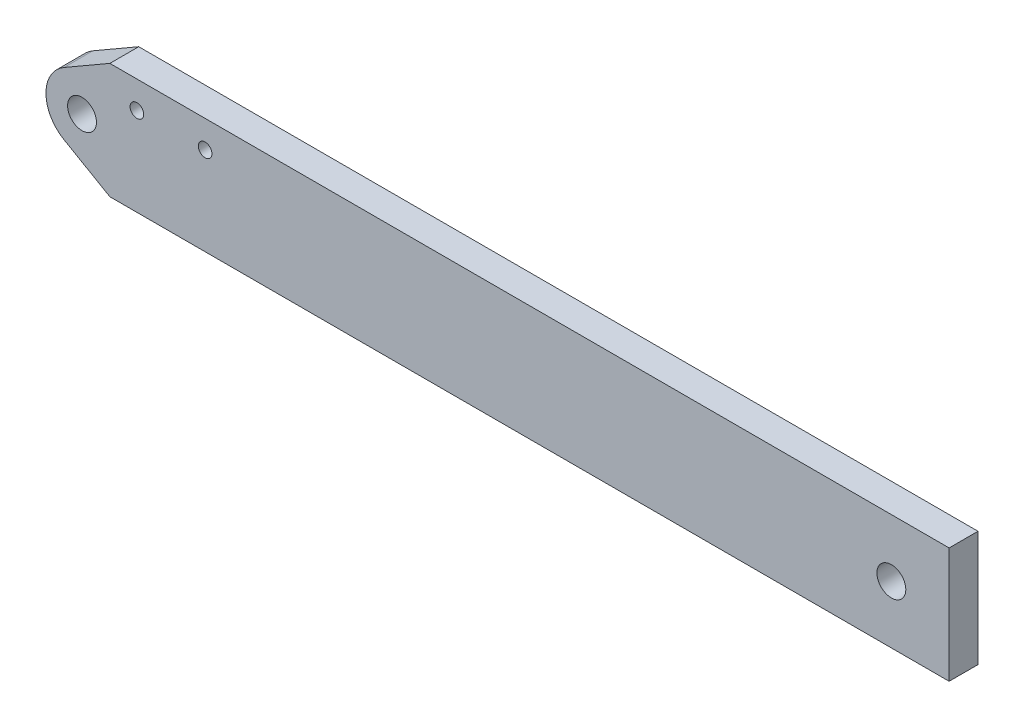
ISO-10303-21;
HEADER;
FILE_DESCRIPTION(('STEP AP214'),'2;1');
FILE_NAME('part.step','',(''),(''),'','','');
FILE_SCHEMA(('AUTOMOTIVE_DESIGN { 1 0 10303 214 1 1 1 1 }'));
ENDSEC;
DATA;
#1=APPLICATION_CONTEXT('core data for automotive mechanical design processes');
#2=APPLICATION_PROTOCOL_DEFINITION('international standard','automotive_design',2000,#1);
#3=PRODUCT_CONTEXT('',#1,'mechanical');
#4=PRODUCT('Part','Part','',(#3));
#5=PRODUCT_RELATED_PRODUCT_CATEGORY('part','',(#4));
#6=PRODUCT_DEFINITION_FORMATION('','',#4);
#7=PRODUCT_DEFINITION_CONTEXT('part definition',#1,'design');
#8=PRODUCT_DEFINITION('design','',#6,#7);
#9=PRODUCT_DEFINITION_SHAPE('','',#8);
#10=(LENGTH_UNIT() NAMED_UNIT(*) SI_UNIT(.MILLI.,.METRE.));
#11=(NAMED_UNIT(*) PLANE_ANGLE_UNIT() SI_UNIT($,.RADIAN.));
#12=(NAMED_UNIT(*) SI_UNIT($,.STERADIAN.) SOLID_ANGLE_UNIT());
#13=UNCERTAINTY_MEASURE_WITH_UNIT(LENGTH_MEASURE(1.E-05),#10,'distance_accuracy_value','');
#14=(GEOMETRIC_REPRESENTATION_CONTEXT(3) GLOBAL_UNCERTAINTY_ASSIGNED_CONTEXT((#13)) GLOBAL_UNIT_ASSIGNED_CONTEXT((#10,
#11,#12)) REPRESENTATION_CONTEXT('',''));
#15=CARTESIAN_POINT('',(0.,0.,0.));
#16=DIRECTION('',(0.,0.,1.));
#17=DIRECTION('',(1.,0.,0.));
#18=AXIS2_PLACEMENT_3D('',#15,#16,#17);
#19=CARTESIAN_POINT('',(200.,0.,0.));
#20=DIRECTION('',(0.,0.,-1.));
#21=DIRECTION('',(-1.,0.,0.));
#22=AXIS2_PLACEMENT_3D('',#19,#20,#21);
#23=PLANE('',#22);
#24=CARTESIAN_POINT('',(36.385,19.4,0.));
#25=DIRECTION('',(0.,0.,1.));
#26=DIRECTION('',(1.,0.,0.));
#27=AXIS2_PLACEMENT_3D('',#24,#25,#26);
#28=CIRCLE('',#27,1.5);
#29=CARTESIAN_POINT('',(37.885,19.4,0.));
#30=VERTEX_POINT('',#29);
#31=EDGE_CURVE('E149',#30,#30,#28,.T.);
#32=ORIENTED_EDGE('',*,*,#31,.F.);
#33=EDGE_LOOP('',(#32));
#34=FACE_BOUND('',#33,.T.);
#35=CARTESIAN_POINT('',(21.385,19.4,0.));
#36=DIRECTION('',(0.,0.,1.));
#37=DIRECTION('',(1.,0.,0.));
#38=AXIS2_PLACEMENT_3D('',#35,#36,#37);
#39=CIRCLE('',#38,1.5);
#40=CARTESIAN_POINT('',(22.885,19.4,0.));
#41=VERTEX_POINT('',#40);
#42=EDGE_CURVE('E143',#41,#41,#39,.T.);
#43=ORIENTED_EDGE('',*,*,#42,.F.);
#44=EDGE_LOOP('',(#43));
#45=FACE_BOUND('',#44,.T.);
#46=CARTESIAN_POINT('',(9.325,12.7,0.));
#47=DIRECTION('',(0.,0.,1.));
#48=DIRECTION('',(1.,0.,0.));
#49=AXIS2_PLACEMENT_3D('',#46,#47,#48);
#50=CIRCLE('',#49,3.175);
#51=CARTESIAN_POINT('',(12.5,12.7,0.));
#52=VERTEX_POINT('',#51);
#53=EDGE_CURVE('E124',#52,#52,#50,.T.);
#54=ORIENTED_EDGE('',*,*,#53,.F.);
#55=EDGE_LOOP('',(#54));
#56=FACE_BOUND('',#55,.T.);
#57=CARTESIAN_POINT('',(187.3,12.7,0.));
#58=DIRECTION('',(0.,0.,1.));
#59=DIRECTION('',(1.,0.,0.));
#60=AXIS2_PLACEMENT_3D('',#57,#58,#59);
#61=CIRCLE('',#60,3.175);
#62=CARTESIAN_POINT('',(190.475,12.7,0.));
#63=VERTEX_POINT('',#62);
#64=EDGE_CURVE('E118',#63,#63,#61,.T.);
#65=ORIENTED_EDGE('',*,*,#64,.F.);
#66=EDGE_LOOP('',(#65));
#67=FACE_BOUND('',#66,.T.);
#68=DIRECTION('',(-1.,0.,0.));
#69=VECTOR('',#68,1.);
#70=CARTESIAN_POINT('',(200.,25.4,0.));
#71=LINE('',#70,#69);
#72=CARTESIAN_POINT('',(200.,25.4,0.));
#73=VERTEX_POINT('',#72);
#74=CARTESIAN_POINT('',(15.4420452561249,25.4,0.));
#75=VERTEX_POINT('',#74);
#76=EDGE_CURVE('E105',#73,#75,#71,.T.);
#77=ORIENTED_EDGE('',*,*,#76,.T.);
#78=DIRECTION('',(0.866025403784442,0.499999999999994,0.));
#79=VECTOR('',#78,1.);
#80=CARTESIAN_POINT('',(5.35499967472869,19.576241518253,0.));
#81=LINE('',#80,#79);
#82=CARTESIAN_POINT('',(5.35499967472869,19.576241518253,0.));
#83=VERTEX_POINT('',#82);
#84=EDGE_CURVE('E46',#83,#75,#81,.T.);
#85=ORIENTED_EDGE('',*,*,#84,.F.);
#86=CARTESIAN_POINT('',(9.325,12.7,0.));
#87=DIRECTION('',(0.,0.,-1.));
#88=DIRECTION('',(1.,0.,0.));
#89=AXIS2_PLACEMENT_3D('',#86,#87,#88);
#90=CIRCLE('',#89,7.94000000000001);
#91=CARTESIAN_POINT('',(5.35499967472869,5.82375848174704,0.));
#92=VERTEX_POINT('',#91);
#93=EDGE_CURVE('E102',#92,#83,#90,.T.);
#94=ORIENTED_EDGE('',*,*,#93,.F.);
#95=DIRECTION('',(-0.866025403784442,0.499999999999994,0.));
#96=VECTOR('',#95,1.);
#97=CARTESIAN_POINT('',(15.4420452561249,0.,0.));
#98=LINE('',#97,#96);
#99=CARTESIAN_POINT('',(15.4420452561249,0.,0.));
#100=VERTEX_POINT('',#99);
#101=EDGE_CURVE('E136',#100,#92,#98,.T.);
#102=ORIENTED_EDGE('',*,*,#101,.F.);
#103=DIRECTION('',(-1.,0.,0.));
#104=VECTOR('',#103,1.);
#105=CARTESIAN_POINT('',(200.,0.,0.));
#106=LINE('',#105,#104);
#107=CARTESIAN_POINT('',(200.,0.,0.));
#108=VERTEX_POINT('',#107);
#109=EDGE_CURVE('E11',#108,#100,#106,.T.);
#110=ORIENTED_EDGE('',*,*,#109,.F.);
#111=DIRECTION('',(0.,-1.,0.));
#112=VECTOR('',#111,1.);
#113=CARTESIAN_POINT('',(200.,0.,0.));
#114=LINE('',#113,#112);
#115=EDGE_CURVE('E115',#73,#108,#114,.T.);
#116=ORIENTED_EDGE('',*,*,#115,.F.);
#117=EDGE_LOOP('',(#77,#85,#94,#102,#110,#116));
#118=FACE_BOUND('',#117,.T.);
#119=ADVANCED_FACE('F32',(#34,#45,#56,#67,#118),#23,.F.);
#120=CARTESIAN_POINT('',(200.,0.,0.));
#121=DIRECTION('',(0.,1.,0.));
#122=DIRECTION('',(0.,0.,1.));
#123=AXIS2_PLACEMENT_3D('',#120,#121,#122);
#124=PLANE('',#123);
#125=ORIENTED_EDGE('',*,*,#109,.T.);
#126=DIRECTION('',(0.,0.,1.));
#127=VECTOR('',#126,1.);
#128=CARTESIAN_POINT('',(15.4420452561249,0.,-6.35));
#129=LINE('',#128,#127);
#130=CARTESIAN_POINT('',(15.4420452561249,0.,-6.35));
#131=VERTEX_POINT('',#130);
#132=EDGE_CURVE('E91',#131,#100,#129,.T.);
#133=ORIENTED_EDGE('',*,*,#132,.F.);
#134=DIRECTION('',(-1.,0.,0.));
#135=VECTOR('',#134,1.);
#136=CARTESIAN_POINT('',(200.,0.,-6.35));
#137=LINE('',#136,#135);
#138=CARTESIAN_POINT('',(200.,0.,-6.35));
#139=VERTEX_POINT('',#138);
#140=EDGE_CURVE('E39',#139,#131,#137,.T.);
#141=ORIENTED_EDGE('',*,*,#140,.F.);
#142=DIRECTION('',(0.,0.,-1.));
#143=VECTOR('',#142,1.);
#144=CARTESIAN_POINT('',(200.,0.,0.));
#145=LINE('',#144,#143);
#146=EDGE_CURVE('E113',#108,#139,#145,.T.);
#147=ORIENTED_EDGE('',*,*,#146,.F.);
#148=EDGE_LOOP('',(#125,#133,#141,#147));
#149=FACE_BOUND('',#148,.T.);
#150=ADVANCED_FACE('F166',(#149),#124,.F.);
#151=CARTESIAN_POINT('',(200.,0.,-6.35));
#152=DIRECTION('',(0.,0.,1.));
#153=DIRECTION('',(0.,-1.,0.));
#154=AXIS2_PLACEMENT_3D('',#151,#152,#153);
#155=PLANE('',#154);
#156=CARTESIAN_POINT('',(36.385,19.4,-6.35));
#157=DIRECTION('',(0.,0.,1.));
#158=DIRECTION('',(1.,0.,0.));
#159=AXIS2_PLACEMENT_3D('',#156,#157,#158);
#160=CIRCLE('',#159,1.5);
#161=CARTESIAN_POINT('',(37.885,19.4,-6.35));
#162=VERTEX_POINT('',#161);
#163=EDGE_CURVE('E146',#162,#162,#160,.T.);
#164=ORIENTED_EDGE('',*,*,#163,.T.);
#165=EDGE_LOOP('',(#164));
#166=FACE_BOUND('',#165,.T.);
#167=CARTESIAN_POINT('',(21.385,19.4,-6.35));
#168=DIRECTION('',(0.,0.,1.));
#169=DIRECTION('',(1.,0.,0.));
#170=AXIS2_PLACEMENT_3D('',#167,#168,#169);
#171=CIRCLE('',#170,1.5);
#172=CARTESIAN_POINT('',(22.885,19.4,-6.35));
#173=VERTEX_POINT('',#172);
#174=EDGE_CURVE('E140',#173,#173,#171,.T.);
#175=ORIENTED_EDGE('',*,*,#174,.T.);
#176=EDGE_LOOP('',(#175));
#177=FACE_BOUND('',#176,.T.);
#178=CARTESIAN_POINT('',(9.325,12.7,-6.35));
#179=DIRECTION('',(0.,0.,1.));
#180=DIRECTION('',(1.,0.,0.));
#181=AXIS2_PLACEMENT_3D('',#178,#179,#180);
#182=CIRCLE('',#181,3.175);
#183=CARTESIAN_POINT('',(12.5,12.7,-6.35));
#184=VERTEX_POINT('',#183);
#185=EDGE_CURVE('E121',#184,#184,#182,.T.);
#186=ORIENTED_EDGE('',*,*,#185,.T.);
#187=EDGE_LOOP('',(#186));
#188=FACE_BOUND('',#187,.T.);
#189=CARTESIAN_POINT('',(187.3,12.7,-6.35));
#190=DIRECTION('',(0.,0.,1.));
#191=DIRECTION('',(1.,0.,0.));
#192=AXIS2_PLACEMENT_3D('',#189,#190,#191);
#193=CIRCLE('',#192,3.175);
#194=CARTESIAN_POINT('',(190.475,12.7,-6.35));
#195=VERTEX_POINT('',#194);
#196=EDGE_CURVE('E117',#195,#195,#193,.T.);
#197=ORIENTED_EDGE('',*,*,#196,.T.);
#198=EDGE_LOOP('',(#197));
#199=FACE_BOUND('',#198,.T.);
#200=CARTESIAN_POINT('',(9.325,12.7,-6.35));
#201=DIRECTION('',(0.,0.,-1.));
#202=DIRECTION('',(1.,0.,0.));
#203=AXIS2_PLACEMENT_3D('',#200,#201,#202);
#204=CIRCLE('',#203,7.94000000000001);
#205=CARTESIAN_POINT('',(5.35499967472869,5.82375848174704,-6.35));
#206=VERTEX_POINT('',#205);
#207=CARTESIAN_POINT('',(5.35499967472869,19.576241518253,-6.35));
#208=VERTEX_POINT('',#207);
#209=EDGE_CURVE('E92',#206,#208,#204,.T.);
#210=ORIENTED_EDGE('',*,*,#209,.T.);
#211=DIRECTION('',(0.866025403784442,0.499999999999994,0.));
#212=VECTOR('',#211,1.);
#213=CARTESIAN_POINT('',(5.35499967472869,19.576241518253,-6.35));
#214=LINE('',#213,#212);
#215=CARTESIAN_POINT('',(15.4420452561249,25.4,-6.35));
#216=VERTEX_POINT('',#215);
#217=EDGE_CURVE('E86',#208,#216,#214,.T.);
#218=ORIENTED_EDGE('',*,*,#217,.T.);
#219=DIRECTION('',(-1.,0.,0.));
#220=VECTOR('',#219,1.);
#221=CARTESIAN_POINT('',(200.,25.4,-6.35));
#222=LINE('',#221,#220);
#223=CARTESIAN_POINT('',(200.,25.4,-6.35));
#224=VERTEX_POINT('',#223);
#225=EDGE_CURVE('E98',#224,#216,#222,.T.);
#226=ORIENTED_EDGE('',*,*,#225,.F.);
#227=DIRECTION('',(0.,1.,0.));
#228=VECTOR('',#227,1.);
#229=CARTESIAN_POINT('',(200.,0.,-6.35));
#230=LINE('',#229,#228);
#231=EDGE_CURVE('E111',#139,#224,#230,.T.);
#232=ORIENTED_EDGE('',*,*,#231,.F.);
#233=ORIENTED_EDGE('',*,*,#140,.T.);
#234=DIRECTION('',(-0.866025403784442,0.499999999999994,0.));
#235=VECTOR('',#234,1.);
#236=CARTESIAN_POINT('',(15.4420452561249,0.,-6.35));
#237=LINE('',#236,#235);
#238=EDGE_CURVE('E101',#131,#206,#237,.T.);
#239=ORIENTED_EDGE('',*,*,#238,.T.);
#240=EDGE_LOOP('',(#210,#218,#226,#232,#233,#239));
#241=FACE_BOUND('',#240,.T.);
#242=ADVANCED_FACE('F96',(#166,#177,#188,#199,#241),#155,.F.);
#243=CARTESIAN_POINT('',(200.,25.4,0.));
#244=DIRECTION('',(0.,-1.,0.));
#245=DIRECTION('',(0.,0.,-1.));
#246=AXIS2_PLACEMENT_3D('',#243,#244,#245);
#247=PLANE('',#246);
#248=ORIENTED_EDGE('',*,*,#225,.T.);
#249=DIRECTION('',(0.,0.,1.));
#250=VECTOR('',#249,1.);
#251=CARTESIAN_POINT('',(15.4420452561249,25.4,-6.35));
#252=LINE('',#251,#250);
#253=EDGE_CURVE('E83',#216,#75,#252,.T.);
#254=ORIENTED_EDGE('',*,*,#253,.T.);
#255=ORIENTED_EDGE('',*,*,#76,.F.);
#256=DIRECTION('',(0.,0.,1.));
#257=VECTOR('',#256,1.);
#258=CARTESIAN_POINT('',(200.,25.4,0.));
#259=LINE('',#258,#257);
#260=EDGE_CURVE('E54',#224,#73,#259,.T.);
#261=ORIENTED_EDGE('',*,*,#260,.F.);
#262=EDGE_LOOP('',(#248,#254,#255,#261));
#263=FACE_BOUND('',#262,.T.);
#264=ADVANCED_FACE('F104',(#263),#247,.F.);
#265=CARTESIAN_POINT('',(200.,0.,0.));
#266=DIRECTION('',(-1.,0.,0.));
#267=DIRECTION('',(0.,0.,1.));
#268=AXIS2_PLACEMENT_3D('',#265,#266,#267);
#269=PLANE('',#268);
#270=ORIENTED_EDGE('',*,*,#115,.T.);
#271=ORIENTED_EDGE('',*,*,#146,.T.);
#272=ORIENTED_EDGE('',*,*,#231,.T.);
#273=ORIENTED_EDGE('',*,*,#260,.T.);
#274=EDGE_LOOP('',(#270,#271,#272,#273));
#275=FACE_BOUND('',#274,.T.);
#276=ADVANCED_FACE('F177',(#275),#269,.F.);
#277=CARTESIAN_POINT('',(187.3,12.7,-6.35));
#278=DIRECTION('',(0.,0.,1.));
#279=DIRECTION('',(1.,0.,0.));
#280=AXIS2_PLACEMENT_3D('',#277,#278,#279);
#281=CYLINDRICAL_SURFACE('',#280,3.175);
#282=ORIENTED_EDGE('',*,*,#196,.F.);
#283=EDGE_LOOP('',(#282));
#284=FACE_BOUND('',#283,.T.);
#285=ORIENTED_EDGE('',*,*,#64,.T.);
#286=EDGE_LOOP('',(#285));
#287=FACE_BOUND('',#286,.T.);
#288=ADVANCED_FACE('F198',(#284,#287),#281,.F.);
#289=CARTESIAN_POINT('',(9.325,12.7,-6.35));
#290=DIRECTION('',(0.,0.,1.));
#291=DIRECTION('',(1.,0.,0.));
#292=AXIS2_PLACEMENT_3D('',#289,#290,#291);
#293=CYLINDRICAL_SURFACE('',#292,3.175);
#294=ORIENTED_EDGE('',*,*,#185,.F.);
#295=EDGE_LOOP('',(#294));
#296=FACE_BOUND('',#295,.T.);
#297=ORIENTED_EDGE('',*,*,#53,.T.);
#298=EDGE_LOOP('',(#297));
#299=FACE_BOUND('',#298,.T.);
#300=ADVANCED_FACE('F192',(#296,#299),#293,.F.);
#301=CARTESIAN_POINT('',(5.35499967472869,19.576241518253,-6.35));
#302=DIRECTION('',(0.499999999999994,-0.866025403784442,0.));
#303=DIRECTION('',(0.866025403784442,0.499999999999994,0.));
#304=AXIS2_PLACEMENT_3D('',#301,#302,#303);
#305=PLANE('',#304);
#306=ORIENTED_EDGE('',*,*,#84,.T.);
#307=ORIENTED_EDGE('',*,*,#253,.F.);
#308=ORIENTED_EDGE('',*,*,#217,.F.);
#309=DIRECTION('',(0.,0.,1.));
#310=VECTOR('',#309,1.);
#311=CARTESIAN_POINT('',(5.35499967472869,19.576241518253,-6.35));
#312=LINE('',#311,#310);
#313=EDGE_CURVE('E127',#208,#83,#312,.T.);
#314=ORIENTED_EDGE('',*,*,#313,.T.);
#315=EDGE_LOOP('',(#306,#307,#308,#314));
#316=FACE_BOUND('',#315,.T.);
#317=ADVANCED_FACE('F85',(#316),#305,.F.);
#318=CARTESIAN_POINT('',(9.325,12.7,-6.35));
#319=DIRECTION('',(0.,0.,1.));
#320=DIRECTION('',(1.,0.,0.));
#321=AXIS2_PLACEMENT_3D('',#318,#319,#320);
#322=CYLINDRICAL_SURFACE('',#321,7.94000000000001);
#323=ORIENTED_EDGE('',*,*,#93,.T.);
#324=ORIENTED_EDGE('',*,*,#313,.F.);
#325=ORIENTED_EDGE('',*,*,#209,.F.);
#326=DIRECTION('',(0.,0.,1.));
#327=VECTOR('',#326,1.);
#328=CARTESIAN_POINT('',(5.35499967472869,5.82375848174704,-6.35));
#329=LINE('',#328,#327);
#330=EDGE_CURVE('E131',#206,#92,#329,.T.);
#331=ORIENTED_EDGE('',*,*,#330,.T.);
#332=EDGE_LOOP('',(#323,#324,#325,#331));
#333=FACE_BOUND('',#332,.T.);
#334=ADVANCED_FACE('F184',(#333),#322,.T.);
#335=CARTESIAN_POINT('',(15.4420452561249,0.,-6.35));
#336=DIRECTION('',(0.499999999999994,0.866025403784442,0.));
#337=DIRECTION('',(-0.866025403784442,0.499999999999994,0.));
#338=AXIS2_PLACEMENT_3D('',#335,#336,#337);
#339=PLANE('',#338);
#340=ORIENTED_EDGE('',*,*,#101,.T.);
#341=ORIENTED_EDGE('',*,*,#330,.F.);
#342=ORIENTED_EDGE('',*,*,#238,.F.);
#343=ORIENTED_EDGE('',*,*,#132,.T.);
#344=EDGE_LOOP('',(#340,#341,#342,#343));
#345=FACE_BOUND('',#344,.T.);
#346=ADVANCED_FACE('F182',(#345),#339,.F.);
#347=CARTESIAN_POINT('',(21.385,19.4,-6.35));
#348=DIRECTION('',(0.,0.,1.));
#349=DIRECTION('',(1.,0.,0.));
#350=AXIS2_PLACEMENT_3D('',#347,#348,#349);
#351=CYLINDRICAL_SURFACE('',#350,1.5);
#352=ORIENTED_EDGE('',*,*,#174,.F.);
#353=EDGE_LOOP('',(#352));
#354=FACE_BOUND('',#353,.T.);
#355=ORIENTED_EDGE('',*,*,#42,.T.);
#356=EDGE_LOOP('',(#355));
#357=FACE_BOUND('',#356,.T.);
#358=ADVANCED_FACE('F160',(#354,#357),#351,.F.);
#359=CARTESIAN_POINT('',(36.385,19.4,-6.35));
#360=DIRECTION('',(0.,0.,1.));
#361=DIRECTION('',(1.,0.,0.));
#362=AXIS2_PLACEMENT_3D('',#359,#360,#361);
#363=CYLINDRICAL_SURFACE('',#362,1.5);
#364=ORIENTED_EDGE('',*,*,#163,.F.);
#365=EDGE_LOOP('',(#364));
#366=FACE_BOUND('',#365,.T.);
#367=ORIENTED_EDGE('',*,*,#31,.T.);
#368=EDGE_LOOP('',(#367));
#369=FACE_BOUND('',#368,.T.);
#370=ADVANCED_FACE('F157',(#366,#369),#363,.F.);
#371=CLOSED_SHELL('',(#119,#150,#242,#264,#276,#288,#300,#317,#334,#346,#358,#370));
#372=MANIFOLD_SOLID_BREP('B2',#371);
#373=ADVANCED_BREP_SHAPE_REPRESENTATION('',(#18,#372),#14);
#374=SHAPE_DEFINITION_REPRESENTATION(#9,#373);
ENDSEC;
END-ISO-10303-21;
